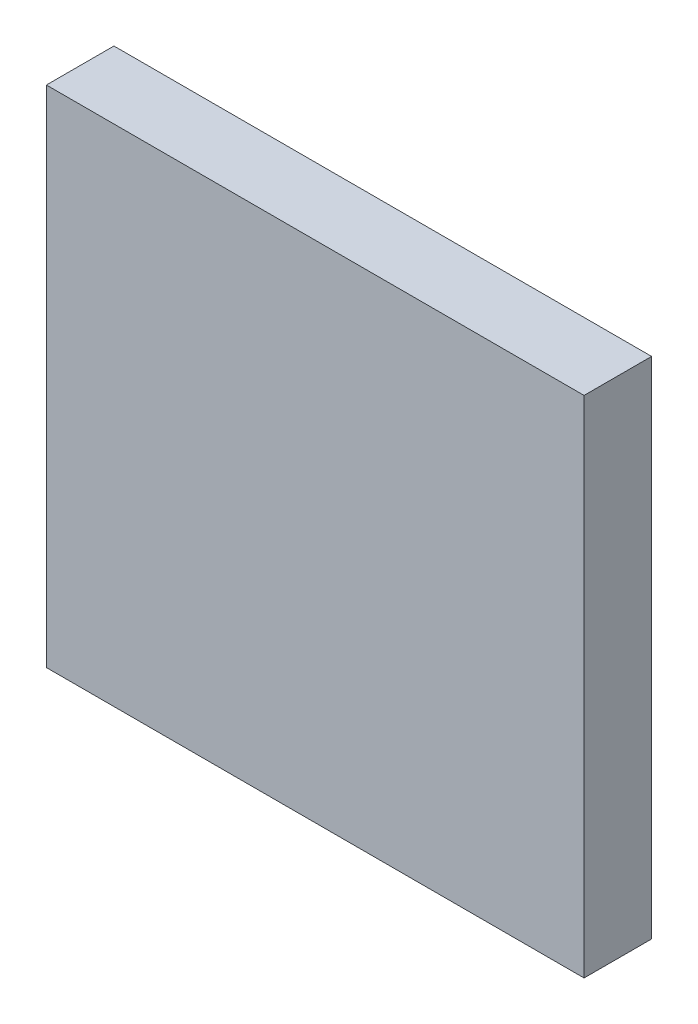
ISO-10303-21;
HEADER;
FILE_DESCRIPTION(('STEP AP214'),'2;1');
FILE_NAME('part.step','',(''),(''),'','','');
FILE_SCHEMA(('AUTOMOTIVE_DESIGN { 1 0 10303 214 1 1 1 1 }'));
ENDSEC;
DATA;
#1=APPLICATION_CONTEXT('core data for automotive mechanical design processes');
#2=APPLICATION_PROTOCOL_DEFINITION('international standard','automotive_design',2000,#1);
#3=PRODUCT_CONTEXT('',#1,'mechanical');
#4=PRODUCT('Part','Part','',(#3));
#5=PRODUCT_RELATED_PRODUCT_CATEGORY('part','',(#4));
#6=PRODUCT_DEFINITION_FORMATION('','',#4);
#7=PRODUCT_DEFINITION_CONTEXT('part definition',#1,'design');
#8=PRODUCT_DEFINITION('design','',#6,#7);
#9=PRODUCT_DEFINITION_SHAPE('','',#8);
#10=(LENGTH_UNIT() NAMED_UNIT(*) SI_UNIT(.MILLI.,.METRE.));
#11=(NAMED_UNIT(*) PLANE_ANGLE_UNIT() SI_UNIT($,.RADIAN.));
#12=(NAMED_UNIT(*) SI_UNIT($,.STERADIAN.) SOLID_ANGLE_UNIT());
#13=UNCERTAINTY_MEASURE_WITH_UNIT(LENGTH_MEASURE(1.E-05),#10,'distance_accuracy_value','');
#14=(GEOMETRIC_REPRESENTATION_CONTEXT(3) GLOBAL_UNCERTAINTY_ASSIGNED_CONTEXT((#13)) GLOBAL_UNIT_ASSIGNED_CONTEXT((#10,
#11,#12)) REPRESENTATION_CONTEXT('',''));
#15=CARTESIAN_POINT('',(0.,0.,0.));
#16=DIRECTION('',(0.,0.,1.));
#17=DIRECTION('',(1.,0.,0.));
#18=AXIS2_PLACEMENT_3D('',#15,#16,#17);
#19=CARTESIAN_POINT('',(107.803273577785,47.3408697660205,10.8572775900885));
#20=DIRECTION('',(0.,0.,1.));
#21=DIRECTION('',(1.,0.,0.));
#22=AXIS2_PLACEMENT_3D('',#19,#20,#21);
#23=PLANE('',#22);
#24=DIRECTION('',(1.,0.,0.));
#25=VECTOR('',#24,1.);
#26=CARTESIAN_POINT('',(107.600273577785,47.3408697660205,10.8572775900885));
#27=LINE('',#26,#25);
#28=CARTESIAN_POINT('',(107.600273577785,47.3408697660205,10.8572775900885));
#29=VERTEX_POINT('',#28);
#30=CARTESIAN_POINT('',(108.006273577785,47.3408697660205,10.8572775900885));
#31=VERTEX_POINT('',#30);
#32=EDGE_CURVE('E78',#29,#31,#27,.T.);
#33=ORIENTED_EDGE('',*,*,#32,.F.);
#34=DIRECTION('',(0.,1.,0.));
#35=VECTOR('',#34,1.);
#36=CARTESIAN_POINT('',(107.600273577785,46.9598697660205,10.8572775900885));
#37=LINE('',#36,#35);
#38=CARTESIAN_POINT('',(107.600273577785,46.9598697660205,10.8572775900885));
#39=VERTEX_POINT('',#38);
#40=EDGE_CURVE('E110',#39,#29,#37,.T.);
#41=ORIENTED_EDGE('',*,*,#40,.F.);
#42=DIRECTION('',(-1.,0.,0.));
#43=VECTOR('',#42,1.);
#44=CARTESIAN_POINT('',(108.006273577785,46.9598697660205,10.8572775900885));
#45=LINE('',#44,#43);
#46=CARTESIAN_POINT('',(108.006273577785,46.9598697660205,10.8572775900885));
#47=VERTEX_POINT('',#46);
#48=EDGE_CURVE('E50',#47,#39,#45,.T.);
#49=ORIENTED_EDGE('',*,*,#48,.F.);
#50=DIRECTION('',(0.,-1.,0.));
#51=VECTOR('',#50,1.);
#52=CARTESIAN_POINT('',(108.006273577785,47.3408697660205,10.8572775900885));
#53=LINE('',#52,#51);
#54=EDGE_CURVE('E101',#31,#47,#53,.T.);
#55=ORIENTED_EDGE('',*,*,#54,.F.);
#56=EDGE_LOOP('',(#33,#41,#49,#55));
#57=FACE_BOUND('',#56,.T.);
#58=ADVANCED_FACE('F40',(#57),#23,.T.);
#59=CARTESIAN_POINT('',(107.803273577785,46.9598697660205,10.8062775900885));
#60=DIRECTION('',(0.,0.,-1.));
#61=DIRECTION('',(-1.,0.,0.));
#62=AXIS2_PLACEMENT_3D('',#59,#60,#61);
#63=PLANE('',#62);
#64=DIRECTION('',(1.,0.,0.));
#65=VECTOR('',#64,1.);
#66=CARTESIAN_POINT('',(107.600273577785,46.9598697660205,10.8062775900885));
#67=LINE('',#66,#65);
#68=CARTESIAN_POINT('',(107.600273577785,46.9598697660205,10.8062775900885));
#69=VERTEX_POINT('',#68);
#70=CARTESIAN_POINT('',(108.006273577785,46.9598697660205,10.8062775900885));
#71=VERTEX_POINT('',#70);
#72=EDGE_CURVE('E11',#69,#71,#67,.T.);
#73=ORIENTED_EDGE('',*,*,#72,.F.);
#74=DIRECTION('',(0.,-1.,0.));
#75=VECTOR('',#74,1.);
#76=CARTESIAN_POINT('',(107.600273577785,47.3408697660205,10.8062775900885));
#77=LINE('',#76,#75);
#78=CARTESIAN_POINT('',(107.600273577785,47.3408697660205,10.8062775900885));
#79=VERTEX_POINT('',#78);
#80=EDGE_CURVE('E89',#79,#69,#77,.T.);
#81=ORIENTED_EDGE('',*,*,#80,.F.);
#82=DIRECTION('',(-1.,0.,0.));
#83=VECTOR('',#82,1.);
#84=CARTESIAN_POINT('',(108.006273577785,47.3408697660205,10.8062775900885));
#85=LINE('',#84,#83);
#86=CARTESIAN_POINT('',(108.006273577785,47.3408697660205,10.8062775900885));
#87=VERTEX_POINT('',#86);
#88=EDGE_CURVE('E44',#87,#79,#85,.T.);
#89=ORIENTED_EDGE('',*,*,#88,.F.);
#90=DIRECTION('',(0.,1.,0.));
#91=VECTOR('',#90,1.);
#92=CARTESIAN_POINT('',(108.006273577785,46.9598697660205,10.8062775900885));
#93=LINE('',#92,#91);
#94=EDGE_CURVE('E86',#71,#87,#93,.T.);
#95=ORIENTED_EDGE('',*,*,#94,.F.);
#96=EDGE_LOOP('',(#73,#81,#89,#95));
#97=FACE_BOUND('',#96,.T.);
#98=ADVANCED_FACE('F85',(#97),#63,.T.);
#99=CARTESIAN_POINT('',(108.006273577785,46.9598697660205,10.8317775900885));
#100=DIRECTION('',(0.,-1.,0.));
#101=DIRECTION('',(0.,0.,-1.));
#102=AXIS2_PLACEMENT_3D('',#99,#100,#101);
#103=PLANE('',#102);
#104=DIRECTION('',(0.,0.,-1.));
#105=VECTOR('',#104,1.);
#106=CARTESIAN_POINT('',(108.006273577785,46.9598697660205,10.8572775900885));
#107=LINE('',#106,#105);
#108=EDGE_CURVE('E97',#47,#71,#107,.T.);
#109=ORIENTED_EDGE('',*,*,#108,.F.);
#110=ORIENTED_EDGE('',*,*,#48,.T.);
#111=DIRECTION('',(0.,0.,1.));
#112=VECTOR('',#111,1.);
#113=CARTESIAN_POINT('',(107.600273577785,46.9598697660205,10.8062775900885));
#114=LINE('',#113,#112);
#115=EDGE_CURVE('E91',#69,#39,#114,.T.);
#116=ORIENTED_EDGE('',*,*,#115,.F.);
#117=ORIENTED_EDGE('',*,*,#72,.T.);
#118=EDGE_LOOP('',(#109,#110,#116,#117));
#119=FACE_BOUND('',#118,.T.);
#120=ADVANCED_FACE('F42',(#119),#103,.T.);
#121=CARTESIAN_POINT('',(107.600273577785,46.9598697660205,10.8317775900885));
#122=DIRECTION('',(-1.,0.,0.));
#123=DIRECTION('',(0.,0.,1.));
#124=AXIS2_PLACEMENT_3D('',#121,#122,#123);
#125=PLANE('',#124);
#126=ORIENTED_EDGE('',*,*,#115,.T.);
#127=ORIENTED_EDGE('',*,*,#40,.T.);
#128=DIRECTION('',(0.,0.,1.));
#129=VECTOR('',#128,1.);
#130=CARTESIAN_POINT('',(107.600273577785,47.3408697660205,10.8062775900885));
#131=LINE('',#130,#129);
#132=EDGE_CURVE('E98',#79,#29,#131,.T.);
#133=ORIENTED_EDGE('',*,*,#132,.F.);
#134=ORIENTED_EDGE('',*,*,#80,.T.);
#135=EDGE_LOOP('',(#126,#127,#133,#134));
#136=FACE_BOUND('',#135,.T.);
#137=ADVANCED_FACE('F113',(#136),#125,.T.);
#138=CARTESIAN_POINT('',(107.600273577785,47.3408697660205,10.8317775900885));
#139=DIRECTION('',(0.,1.,0.));
#140=DIRECTION('',(1.,0.,0.));
#141=AXIS2_PLACEMENT_3D('',#138,#139,#140);
#142=PLANE('',#141);
#143=ORIENTED_EDGE('',*,*,#132,.T.);
#144=ORIENTED_EDGE('',*,*,#32,.T.);
#145=DIRECTION('',(0.,0.,1.));
#146=VECTOR('',#145,1.);
#147=CARTESIAN_POINT('',(108.006273577785,47.3408697660205,10.8062775900885));
#148=LINE('',#147,#146);
#149=EDGE_CURVE('E96',#87,#31,#148,.T.);
#150=ORIENTED_EDGE('',*,*,#149,.F.);
#151=ORIENTED_EDGE('',*,*,#88,.T.);
#152=EDGE_LOOP('',(#143,#144,#150,#151));
#153=FACE_BOUND('',#152,.T.);
#154=ADVANCED_FACE('F100',(#153),#142,.T.);
#155=CARTESIAN_POINT('',(108.006273577785,47.3408697660205,10.8317775900885));
#156=DIRECTION('',(1.,0.,0.));
#157=DIRECTION('',(0.,1.,0.));
#158=AXIS2_PLACEMENT_3D('',#155,#156,#157);
#159=PLANE('',#158);
#160=ORIENTED_EDGE('',*,*,#149,.T.);
#161=ORIENTED_EDGE('',*,*,#54,.T.);
#162=ORIENTED_EDGE('',*,*,#108,.T.);
#163=ORIENTED_EDGE('',*,*,#94,.T.);
#164=EDGE_LOOP('',(#160,#161,#162,#163));
#165=FACE_BOUND('',#164,.T.);
#166=ADVANCED_FACE('F94',(#165),#159,.T.);
#167=CLOSED_SHELL('',(#58,#98,#120,#137,#154,#166));
#168=MANIFOLD_SOLID_BREP('B2',#167);
#169=ADVANCED_BREP_SHAPE_REPRESENTATION('',(#18,#168),#14);
#170=SHAPE_DEFINITION_REPRESENTATION(#9,#169);
ENDSEC;
END-ISO-10303-21;
